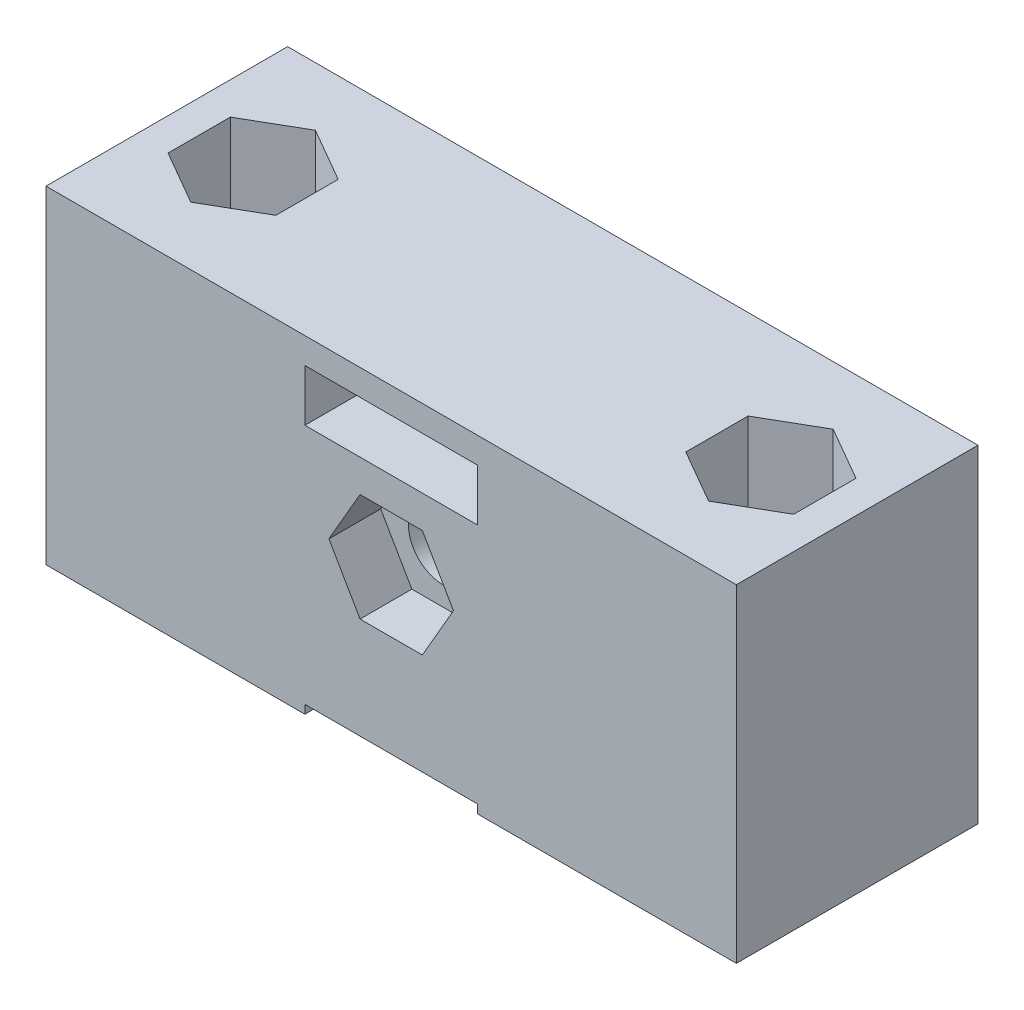
ISO-10303-21;
HEADER;
FILE_DESCRIPTION(('STEP AP214'),'2;1');
FILE_NAME('part.step','',(''),(''),'','','');
FILE_SCHEMA(('AUTOMOTIVE_DESIGN { 1 0 10303 214 1 1 1 1 }'));
ENDSEC;
DATA;
#1=APPLICATION_CONTEXT('core data for automotive mechanical design processes');
#2=APPLICATION_PROTOCOL_DEFINITION('international standard','automotive_design',2000,#1);
#3=PRODUCT_CONTEXT('',#1,'mechanical');
#4=PRODUCT('Part','Part','',(#3));
#5=PRODUCT_RELATED_PRODUCT_CATEGORY('part','',(#4));
#6=PRODUCT_DEFINITION_FORMATION('','',#4);
#7=PRODUCT_DEFINITION_CONTEXT('part definition',#1,'design');
#8=PRODUCT_DEFINITION('design','',#6,#7);
#9=PRODUCT_DEFINITION_SHAPE('','',#8);
#10=(LENGTH_UNIT() NAMED_UNIT(*) SI_UNIT(.MILLI.,.METRE.));
#11=(NAMED_UNIT(*) PLANE_ANGLE_UNIT() SI_UNIT($,.RADIAN.));
#12=(NAMED_UNIT(*) SI_UNIT($,.STERADIAN.) SOLID_ANGLE_UNIT());
#13=UNCERTAINTY_MEASURE_WITH_UNIT(LENGTH_MEASURE(1.E-05),#10,'distance_accuracy_value','');
#14=(GEOMETRIC_REPRESENTATION_CONTEXT(3) GLOBAL_UNCERTAINTY_ASSIGNED_CONTEXT((#13)) GLOBAL_UNIT_ASSIGNED_CONTEXT((#10,
#11,#12)) REPRESENTATION_CONTEXT('',''));
#15=CARTESIAN_POINT('',(0.,0.,0.));
#16=DIRECTION('',(0.,0.,1.));
#17=DIRECTION('',(1.,0.,0.));
#18=AXIS2_PLACEMENT_3D('',#15,#16,#17);
#19=CARTESIAN_POINT('',(0.,9.5,-7.));
#20=DIRECTION('',(0.,0.,1.));
#21=DIRECTION('',(1.,0.,0.));
#22=AXIS2_PLACEMENT_3D('',#19,#20,#21);
#23=CYLINDRICAL_SURFACE('',#22,2.);
#24=CARTESIAN_POINT('',(0.,9.5,-7.));
#25=DIRECTION('',(0.,0.,1.));
#26=DIRECTION('',(1.,0.,0.));
#27=AXIS2_PLACEMENT_3D('',#24,#25,#26);
#28=CIRCLE('',#27,2.);
#29=CARTESIAN_POINT('',(2.,9.5,-7.));
#30=VERTEX_POINT('',#29);
#31=EDGE_CURVE('E389',#30,#30,#28,.T.);
#32=ORIENTED_EDGE('',*,*,#31,.F.);
#33=EDGE_LOOP('',(#32));
#34=FACE_BOUND('',#33,.T.);
#35=CARTESIAN_POINT('',(0.,9.5,4.));
#36=DIRECTION('',(0.,0.,1.));
#37=DIRECTION('',(1.,0.,0.));
#38=AXIS2_PLACEMENT_3D('',#35,#36,#37);
#39=CIRCLE('',#38,2.);
#40=CARTESIAN_POINT('',(2.,9.5,4.));
#41=VERTEX_POINT('',#40);
#42=EDGE_CURVE('E37',#41,#41,#39,.F.);
#43=ORIENTED_EDGE('',*,*,#42,.F.);
#44=EDGE_LOOP('',(#43));
#45=FACE_BOUND('',#44,.T.);
#46=ADVANCED_FACE('F33',(#34,#45),#23,.F.);
#47=CARTESIAN_POINT('',(-15.,0.,0.));
#48=DIRECTION('',(0.,1.,0.));
#49=DIRECTION('',(0.,0.,1.));
#50=AXIS2_PLACEMENT_3D('',#47,#48,#49);
#51=CYLINDRICAL_SURFACE('',#50,1.6);
#52=CARTESIAN_POINT('',(-15.,0.,0.));
#53=DIRECTION('',(0.,1.,0.));
#54=DIRECTION('',(0.,0.,1.));
#55=AXIS2_PLACEMENT_3D('',#52,#53,#54);
#56=CIRCLE('',#55,1.6);
#57=CARTESIAN_POINT('',(-15.,0.,1.6));
#58=VERTEX_POINT('',#57);
#59=EDGE_CURVE('E386',#58,#58,#56,.T.);
#60=ORIENTED_EDGE('',*,*,#59,.F.);
#61=EDGE_LOOP('',(#60));
#62=FACE_BOUND('',#61,.T.);
#63=CARTESIAN_POINT('',(-15.,9.,0.));
#64=DIRECTION('',(0.,1.,0.));
#65=DIRECTION('',(0.,0.,1.));
#66=AXIS2_PLACEMENT_3D('',#63,#64,#65);
#67=CIRCLE('',#66,1.6);
#68=CARTESIAN_POINT('',(-15.,9.,1.6));
#69=VERTEX_POINT('',#68);
#70=EDGE_CURVE('E372',#69,#69,#67,.F.);
#71=ORIENTED_EDGE('',*,*,#70,.F.);
#72=EDGE_LOOP('',(#71));
#73=FACE_BOUND('',#72,.T.);
#74=ADVANCED_FACE('F506',(#62,#73),#51,.F.);
#75=CARTESIAN_POINT('',(0.,0.,0.));
#76=DIRECTION('',(0.,1.,0.));
#77=DIRECTION('',(0.,0.,1.));
#78=AXIS2_PLACEMENT_3D('',#75,#76,#77);
#79=PLANE('',#78);
#80=CARTESIAN_POINT('',(15.,0.,0.));
#81=DIRECTION('',(0.,1.,0.));
#82=DIRECTION('',(0.,0.,-1.));
#83=AXIS2_PLACEMENT_3D('',#80,#81,#82);
#84=CIRCLE('',#83,1.6);
#85=CARTESIAN_POINT('',(15.,0.,-1.60000000000002));
#86=VERTEX_POINT('',#85);
#87=EDGE_CURVE('E383',#86,#86,#84,.T.);
#88=ORIENTED_EDGE('',*,*,#87,.T.);
#89=EDGE_LOOP('',(#88));
#90=FACE_BOUND('',#89,.T.);
#91=DIRECTION('',(1.,0.,0.));
#92=VECTOR('',#91,1.);
#93=CARTESIAN_POINT('',(-20.,0.,7.));
#94=LINE('',#93,#92);
#95=CARTESIAN_POINT('',(5.,0.,7.));
#96=VERTEX_POINT('',#95);
#97=CARTESIAN_POINT('',(20.,0.,7.));
#98=VERTEX_POINT('',#97);
#99=EDGE_CURVE('E465',#96,#98,#94,.T.);
#100=ORIENTED_EDGE('',*,*,#99,.F.);
#101=DIRECTION('',(0.,0.,-1.));
#102=VECTOR('',#101,1.);
#103=CARTESIAN_POINT('',(5.,0.,0.));
#104=LINE('',#103,#102);
#105=CARTESIAN_POINT('',(5.,0.,-7.));
#106=VERTEX_POINT('',#105);
#107=EDGE_CURVE('E11',#96,#106,#104,.T.);
#108=ORIENTED_EDGE('',*,*,#107,.T.);
#109=DIRECTION('',(-1.,0.,0.));
#110=VECTOR('',#109,1.);
#111=CARTESIAN_POINT('',(-20.,0.,-7.));
#112=LINE('',#111,#110);
#113=CARTESIAN_POINT('',(20.,0.,-7.));
#114=VERTEX_POINT('',#113);
#115=EDGE_CURVE('E460',#114,#106,#112,.T.);
#116=ORIENTED_EDGE('',*,*,#115,.F.);
#117=DIRECTION('',(0.,0.,-1.));
#118=VECTOR('',#117,1.);
#119=CARTESIAN_POINT('',(20.,0.,-7.));
#120=LINE('',#119,#118);
#121=EDGE_CURVE('E445',#98,#114,#120,.T.);
#122=ORIENTED_EDGE('',*,*,#121,.F.);
#123=EDGE_LOOP('',(#100,#108,#116,#122));
#124=FACE_BOUND('',#123,.T.);
#125=ADVANCED_FACE('F512',(#90,#124),#79,.F.);
#126=CARTESIAN_POINT('',(20.,19.,-7.));
#127=DIRECTION('',(-1.,0.,0.));
#128=DIRECTION('',(0.,0.,1.));
#129=AXIS2_PLACEMENT_3D('',#126,#127,#128);
#130=PLANE('',#129);
#131=ORIENTED_EDGE('',*,*,#121,.T.);
#132=DIRECTION('',(0.,-1.,0.));
#133=VECTOR('',#132,1.);
#134=CARTESIAN_POINT('',(20.,19.,-7.));
#135=LINE('',#134,#133);
#136=CARTESIAN_POINT('',(20.,19.,-7.));
#137=VERTEX_POINT('',#136);
#138=EDGE_CURVE('E476',#137,#114,#135,.T.);
#139=ORIENTED_EDGE('',*,*,#138,.F.);
#140=DIRECTION('',(0.,0.,-1.));
#141=VECTOR('',#140,1.);
#142=CARTESIAN_POINT('',(20.,19.,-7.));
#143=LINE('',#142,#141);
#144=CARTESIAN_POINT('',(20.,19.,7.));
#145=VERTEX_POINT('',#144);
#146=EDGE_CURVE('E446',#145,#137,#143,.T.);
#147=ORIENTED_EDGE('',*,*,#146,.F.);
#148=DIRECTION('',(0.,-1.,0.));
#149=VECTOR('',#148,1.);
#150=CARTESIAN_POINT('',(20.,19.,7.));
#151=LINE('',#150,#149);
#152=EDGE_CURVE('E456',#145,#98,#151,.T.);
#153=ORIENTED_EDGE('',*,*,#152,.T.);
#154=EDGE_LOOP('',(#131,#139,#147,#153));
#155=FACE_BOUND('',#154,.T.);
#156=ADVANCED_FACE('F35',(#155),#130,.F.);
#157=CARTESIAN_POINT('',(-20.,19.,-7.));
#158=DIRECTION('',(0.,0.,1.));
#159=DIRECTION('',(1.,0.,0.));
#160=AXIS2_PLACEMENT_3D('',#157,#158,#159);
#161=PLANE('',#160);
#162=ORIENTED_EDGE('',*,*,#31,.T.);
#163=EDGE_LOOP('',(#162));
#164=FACE_BOUND('',#163,.T.);
#165=ORIENTED_EDGE('',*,*,#115,.T.);
#166=DIRECTION('',(0.,1.,0.));
#167=VECTOR('',#166,1.);
#168=CARTESIAN_POINT('',(5.,19.,-7.));
#169=LINE('',#168,#167);
#170=CARTESIAN_POINT('',(5.,0.5,-7.));
#171=VERTEX_POINT('',#170);
#172=EDGE_CURVE('E407',#106,#171,#169,.T.);
#173=ORIENTED_EDGE('',*,*,#172,.T.);
#174=DIRECTION('',(-1.,0.,0.));
#175=VECTOR('',#174,1.);
#176=CARTESIAN_POINT('',(-20.,0.5,-7.));
#177=LINE('',#176,#175);
#178=CARTESIAN_POINT('',(-5.,0.5,-7.));
#179=VERTEX_POINT('',#178);
#180=EDGE_CURVE('E410',#171,#179,#177,.T.);
#181=ORIENTED_EDGE('',*,*,#180,.T.);
#182=DIRECTION('',(0.,-1.,0.));
#183=VECTOR('',#182,1.);
#184=CARTESIAN_POINT('',(-5.,19.,-7.));
#185=LINE('',#184,#183);
#186=CARTESIAN_POINT('',(-5.,0.,-7.));
#187=VERTEX_POINT('',#186);
#188=EDGE_CURVE('E403',#179,#187,#185,.T.);
#189=ORIENTED_EDGE('',*,*,#188,.T.);
#190=CARTESIAN_POINT('',(-20.,0.,-7.));
#191=VERTEX_POINT('',#190);
#192=EDGE_CURVE('E459',#187,#191,#112,.T.);
#193=ORIENTED_EDGE('',*,*,#192,.T.);
#194=DIRECTION('',(0.,-1.,0.));
#195=VECTOR('',#194,1.);
#196=CARTESIAN_POINT('',(-20.,19.,-7.));
#197=LINE('',#196,#195);
#198=CARTESIAN_POINT('',(-20.,19.,-7.));
#199=VERTEX_POINT('',#198);
#200=EDGE_CURVE('E473',#199,#191,#197,.T.);
#201=ORIENTED_EDGE('',*,*,#200,.F.);
#202=DIRECTION('',(-1.,0.,0.));
#203=VECTOR('',#202,1.);
#204=CARTESIAN_POINT('',(-20.,19.,-7.));
#205=LINE('',#204,#203);
#206=EDGE_CURVE('E449',#137,#199,#205,.T.);
#207=ORIENTED_EDGE('',*,*,#206,.F.);
#208=ORIENTED_EDGE('',*,*,#138,.T.);
#209=EDGE_LOOP('',(#165,#173,#181,#189,#193,#201,#207,#208));
#210=FACE_BOUND('',#209,.T.);
#211=DIRECTION('',(1.,0.,0.));
#212=VECTOR('',#211,1.);
#213=CARTESIAN_POINT('',(-20.,14.5,-7.));
#214=LINE('',#213,#212);
#215=CARTESIAN_POINT('',(-5.,14.5,-7.));
#216=VERTEX_POINT('',#215);
#217=CARTESIAN_POINT('',(5.,14.5,-7.));
#218=VERTEX_POINT('',#217);
#219=EDGE_CURVE('E439',#216,#218,#214,.T.);
#220=ORIENTED_EDGE('',*,*,#219,.T.);
#221=DIRECTION('',(0.,1.,0.));
#222=VECTOR('',#221,1.);
#223=CARTESIAN_POINT('',(5.,19.,-7.));
#224=LINE('',#223,#222);
#225=CARTESIAN_POINT('',(5.,17.5,-7.));
#226=VERTEX_POINT('',#225);
#227=EDGE_CURVE('E442',#218,#226,#224,.T.);
#228=ORIENTED_EDGE('',*,*,#227,.T.);
#229=DIRECTION('',(-1.,0.,0.));
#230=VECTOR('',#229,1.);
#231=CARTESIAN_POINT('',(-20.,17.5,-7.));
#232=LINE('',#231,#230);
#233=CARTESIAN_POINT('',(-5.,17.5,-7.));
#234=VERTEX_POINT('',#233);
#235=EDGE_CURVE('E427',#226,#234,#232,.T.);
#236=ORIENTED_EDGE('',*,*,#235,.T.);
#237=DIRECTION('',(0.,-1.,0.));
#238=VECTOR('',#237,1.);
#239=CARTESIAN_POINT('',(-5.,19.,-7.));
#240=LINE('',#239,#238);
#241=EDGE_CURVE('E436',#234,#216,#240,.T.);
#242=ORIENTED_EDGE('',*,*,#241,.T.);
#243=EDGE_LOOP('',(#220,#228,#236,#242));
#244=FACE_BOUND('',#243,.T.);
#245=ADVANCED_FACE('F561',(#164,#210,#244),#161,.F.);
#246=CARTESIAN_POINT('',(-20.,19.,-7.));
#247=DIRECTION('',(1.,0.,0.));
#248=DIRECTION('',(0.,0.,-1.));
#249=AXIS2_PLACEMENT_3D('',#246,#247,#248);
#250=PLANE('',#249);
#251=DIRECTION('',(0.,0.,1.));
#252=VECTOR('',#251,1.);
#253=CARTESIAN_POINT('',(-20.,0.,-7.));
#254=LINE('',#253,#252);
#255=CARTESIAN_POINT('',(-20.,0.,7.));
#256=VERTEX_POINT('',#255);
#257=EDGE_CURVE('E463',#191,#256,#254,.T.);
#258=ORIENTED_EDGE('',*,*,#257,.T.);
#259=DIRECTION('',(0.,-1.,0.));
#260=VECTOR('',#259,1.);
#261=CARTESIAN_POINT('',(-20.,19.,7.));
#262=LINE('',#261,#260);
#263=CARTESIAN_POINT('',(-20.,19.,7.));
#264=VERTEX_POINT('',#263);
#265=EDGE_CURVE('E470',#264,#256,#262,.T.);
#266=ORIENTED_EDGE('',*,*,#265,.F.);
#267=DIRECTION('',(0.,0.,1.));
#268=VECTOR('',#267,1.);
#269=CARTESIAN_POINT('',(-20.,19.,-7.));
#270=LINE('',#269,#268);
#271=EDGE_CURVE('E452',#199,#264,#270,.T.);
#272=ORIENTED_EDGE('',*,*,#271,.F.);
#273=ORIENTED_EDGE('',*,*,#200,.T.);
#274=EDGE_LOOP('',(#258,#266,#272,#273));
#275=FACE_BOUND('',#274,.T.);
#276=ADVANCED_FACE('F558',(#275),#250,.F.);
#277=CARTESIAN_POINT('',(-20.,19.,7.));
#278=DIRECTION('',(0.,0.,-1.));
#279=DIRECTION('',(-1.,0.,0.));
#280=AXIS2_PLACEMENT_3D('',#277,#278,#279);
#281=PLANE('',#280);
#282=DIRECTION('',(-1.,0.,0.));
#283=VECTOR('',#282,1.);
#284=CARTESIAN_POINT('',(1.80421959121758,12.625,7.));
#285=LINE('',#284,#283);
#286=CARTESIAN_POINT('',(1.80421959121758,12.625,7.));
#287=VERTEX_POINT('',#286);
#288=CARTESIAN_POINT('',(-1.80421959121758,12.625,7.));
#289=VERTEX_POINT('',#288);
#290=EDGE_CURVE('E268',#287,#289,#285,.T.);
#291=ORIENTED_EDGE('',*,*,#290,.F.);
#292=DIRECTION('',(-0.5,0.866025403784439,0.));
#293=VECTOR('',#292,1.);
#294=CARTESIAN_POINT('',(3.60843918243516,9.5,7.));
#295=LINE('',#294,#293);
#296=CARTESIAN_POINT('',(3.60843918243516,9.5,7.));
#297=VERTEX_POINT('',#296);
#298=EDGE_CURVE('E50',#297,#287,#295,.T.);
#299=ORIENTED_EDGE('',*,*,#298,.F.);
#300=DIRECTION('',(0.5,0.866025403784439,0.));
#301=VECTOR('',#300,1.);
#302=CARTESIAN_POINT('',(1.80421959121758,6.375,7.));
#303=LINE('',#302,#301);
#304=CARTESIAN_POINT('',(1.80421959121758,6.375,7.));
#305=VERTEX_POINT('',#304);
#306=EDGE_CURVE('E254',#305,#297,#303,.T.);
#307=ORIENTED_EDGE('',*,*,#306,.F.);
#308=DIRECTION('',(1.,0.,0.));
#309=VECTOR('',#308,1.);
#310=CARTESIAN_POINT('',(-1.80421959121758,6.375,7.));
#311=LINE('',#310,#309);
#312=CARTESIAN_POINT('',(-1.80421959121758,6.375,7.));
#313=VERTEX_POINT('',#312);
#314=EDGE_CURVE('E257',#313,#305,#311,.T.);
#315=ORIENTED_EDGE('',*,*,#314,.F.);
#316=DIRECTION('',(0.5,-0.866025403784438,0.));
#317=VECTOR('',#316,1.);
#318=CARTESIAN_POINT('',(-3.60843918243516,9.5,7.));
#319=LINE('',#318,#317);
#320=CARTESIAN_POINT('',(-3.60843918243516,9.5,7.));
#321=VERTEX_POINT('',#320);
#322=EDGE_CURVE('E273',#321,#313,#319,.T.);
#323=ORIENTED_EDGE('',*,*,#322,.F.);
#324=DIRECTION('',(-0.5,-0.866025403784439,0.));
#325=VECTOR('',#324,1.);
#326=CARTESIAN_POINT('',(-1.80421959121758,12.625,7.));
#327=LINE('',#326,#325);
#328=EDGE_CURVE('E270',#289,#321,#327,.T.);
#329=ORIENTED_EDGE('',*,*,#328,.F.);
#330=EDGE_LOOP('',(#291,#299,#307,#315,#323,#329));
#331=FACE_BOUND('',#330,.T.);
#332=DIRECTION('',(-1.,0.,0.));
#333=VECTOR('',#332,1.);
#334=CARTESIAN_POINT('',(-5.,17.5,7.));
#335=LINE('',#334,#333);
#336=CARTESIAN_POINT('',(5.,17.5,7.));
#337=VERTEX_POINT('',#336);
#338=CARTESIAN_POINT('',(-5.,17.5,7.));
#339=VERTEX_POINT('',#338);
#340=EDGE_CURVE('E415',#337,#339,#335,.T.);
#341=ORIENTED_EDGE('',*,*,#340,.F.);
#342=DIRECTION('',(0.,1.,0.));
#343=VECTOR('',#342,1.);
#344=CARTESIAN_POINT('',(5.,14.5,7.));
#345=LINE('',#344,#343);
#346=CARTESIAN_POINT('',(5.,14.5,7.));
#347=VERTEX_POINT('',#346);
#348=EDGE_CURVE('E413',#347,#337,#345,.T.);
#349=ORIENTED_EDGE('',*,*,#348,.F.);
#350=DIRECTION('',(1.,0.,0.));
#351=VECTOR('',#350,1.);
#352=CARTESIAN_POINT('',(-5.,14.5,7.));
#353=LINE('',#352,#351);
#354=CARTESIAN_POINT('',(-5.,14.5,7.));
#355=VERTEX_POINT('',#354);
#356=EDGE_CURVE('E421',#355,#347,#353,.T.);
#357=ORIENTED_EDGE('',*,*,#356,.F.);
#358=DIRECTION('',(0.,-1.,0.));
#359=VECTOR('',#358,1.);
#360=CARTESIAN_POINT('',(-5.,14.5,7.));
#361=LINE('',#360,#359);
#362=EDGE_CURVE('E418',#339,#355,#361,.T.);
#363=ORIENTED_EDGE('',*,*,#362,.F.);
#364=EDGE_LOOP('',(#341,#349,#357,#363));
#365=FACE_BOUND('',#364,.T.);
#366=DIRECTION('',(-1.,0.,0.));
#367=VECTOR('',#366,1.);
#368=CARTESIAN_POINT('',(-5.,0.5,7.));
#369=LINE('',#368,#367);
#370=CARTESIAN_POINT('',(5.,0.5,7.));
#371=VERTEX_POINT('',#370);
#372=CARTESIAN_POINT('',(-5.,0.5,7.));
#373=VERTEX_POINT('',#372);
#374=EDGE_CURVE('E395',#371,#373,#369,.T.);
#375=ORIENTED_EDGE('',*,*,#374,.F.);
#376=DIRECTION('',(0.,1.,0.));
#377=VECTOR('',#376,1.);
#378=CARTESIAN_POINT('',(5.,-0.5,7.));
#379=LINE('',#378,#377);
#380=EDGE_CURVE('E392',#96,#371,#379,.T.);
#381=ORIENTED_EDGE('',*,*,#380,.F.);
#382=ORIENTED_EDGE('',*,*,#99,.T.);
#383=ORIENTED_EDGE('',*,*,#152,.F.);
#384=DIRECTION('',(1.,0.,0.));
#385=VECTOR('',#384,1.);
#386=CARTESIAN_POINT('',(-20.,19.,7.));
#387=LINE('',#386,#385);
#388=EDGE_CURVE('E454',#264,#145,#387,.T.);
#389=ORIENTED_EDGE('',*,*,#388,.F.);
#390=ORIENTED_EDGE('',*,*,#265,.T.);
#391=CARTESIAN_POINT('',(-5.,0.,7.));
#392=VERTEX_POINT('',#391);
#393=EDGE_CURVE('E450',#256,#392,#94,.T.);
#394=ORIENTED_EDGE('',*,*,#393,.T.);
#395=DIRECTION('',(0.,-1.,0.));
#396=VECTOR('',#395,1.);
#397=CARTESIAN_POINT('',(-5.,-0.5,7.));
#398=LINE('',#397,#396);
#399=EDGE_CURVE('E398',#373,#392,#398,.T.);
#400=ORIENTED_EDGE('',*,*,#399,.F.);
#401=EDGE_LOOP('',(#375,#381,#382,#383,#389,#390,#394,#400));
#402=FACE_BOUND('',#401,.T.);
#403=ADVANCED_FACE('F551',(#331,#365,#402),#281,.F.);
#404=CARTESIAN_POINT('',(0.,19.,0.));
#405=DIRECTION('',(0.,1.,0.));
#406=DIRECTION('',(0.,0.,1.));
#407=AXIS2_PLACEMENT_3D('',#404,#405,#406);
#408=PLANE('',#407);
#409=DIRECTION('',(0.,0.,1.));
#410=VECTOR('',#409,1.);
#411=CARTESIAN_POINT('',(11.875,19.,1.80421959121758));
#412=LINE('',#411,#410);
#413=CARTESIAN_POINT('',(11.875,19.,-1.80421959121758));
#414=VERTEX_POINT('',#413);
#415=CARTESIAN_POINT('',(11.875,19.,1.80421959121758));
#416=VERTEX_POINT('',#415);
#417=EDGE_CURVE('E58',#414,#416,#412,.T.);
#418=ORIENTED_EDGE('',*,*,#417,.F.);
#419=DIRECTION('',(-0.866025403784438,0.,0.5));
#420=VECTOR('',#419,1.);
#421=CARTESIAN_POINT('',(11.875,19.,-1.80421959121758));
#422=LINE('',#421,#420);
#423=CARTESIAN_POINT('',(15.,19.,-3.60843918243516));
#424=VERTEX_POINT('',#423);
#425=EDGE_CURVE('E291',#424,#414,#422,.T.);
#426=ORIENTED_EDGE('',*,*,#425,.F.);
#427=DIRECTION('',(-0.866025403784439,0.,-0.5));
#428=VECTOR('',#427,1.);
#429=CARTESIAN_POINT('',(15.,19.,-3.60843918243516));
#430=LINE('',#429,#428);
#431=CARTESIAN_POINT('',(18.125,19.,-1.80421959121759));
#432=VERTEX_POINT('',#431);
#433=EDGE_CURVE('E317',#432,#424,#430,.T.);
#434=ORIENTED_EDGE('',*,*,#433,.F.);
#435=DIRECTION('',(0.,0.,-1.));
#436=VECTOR('',#435,1.);
#437=CARTESIAN_POINT('',(18.125,19.,-1.80421959121759));
#438=LINE('',#437,#436);
#439=CARTESIAN_POINT('',(18.125,19.,1.80421959121758));
#440=VERTEX_POINT('',#439);
#441=EDGE_CURVE('E314',#440,#432,#438,.T.);
#442=ORIENTED_EDGE('',*,*,#441,.F.);
#443=DIRECTION('',(0.866025403784438,0.,-0.5));
#444=VECTOR('',#443,1.);
#445=CARTESIAN_POINT('',(18.125,19.,1.80421959121758));
#446=LINE('',#445,#444);
#447=CARTESIAN_POINT('',(15.,19.,3.60843918243516));
#448=VERTEX_POINT('',#447);
#449=EDGE_CURVE('E311',#448,#440,#446,.T.);
#450=ORIENTED_EDGE('',*,*,#449,.F.);
#451=DIRECTION('',(0.866025403784439,0.,0.5));
#452=VECTOR('',#451,1.);
#453=CARTESIAN_POINT('',(15.,19.,3.60843918243516));
#454=LINE('',#453,#452);
#455=EDGE_CURVE('E308',#416,#448,#454,.T.);
#456=ORIENTED_EDGE('',*,*,#455,.F.);
#457=EDGE_LOOP('',(#418,#426,#434,#442,#450,#456));
#458=FACE_BOUND('',#457,.T.);
#459=DIRECTION('',(-0.866025403784438,0.,-0.5));
#460=VECTOR('',#459,1.);
#461=CARTESIAN_POINT('',(-11.875,19.,-1.80421959121758));
#462=LINE('',#461,#460);
#463=CARTESIAN_POINT('',(-11.875,19.,-1.80421959121758));
#464=VERTEX_POINT('',#463);
#465=CARTESIAN_POINT('',(-15.,19.,-3.60843918243516));
#466=VERTEX_POINT('',#465);
#467=EDGE_CURVE('E354',#464,#466,#462,.T.);
#468=ORIENTED_EDGE('',*,*,#467,.F.);
#469=DIRECTION('',(0.,0.,-1.));
#470=VECTOR('',#469,1.);
#471=CARTESIAN_POINT('',(-11.875,19.,1.80421959121758));
#472=LINE('',#471,#470);
#473=CARTESIAN_POINT('',(-11.875,19.,1.80421959121758));
#474=VERTEX_POINT('',#473);
#475=EDGE_CURVE('E338',#474,#464,#472,.T.);
#476=ORIENTED_EDGE('',*,*,#475,.F.);
#477=DIRECTION('',(0.866025403784439,0.,-0.5));
#478=VECTOR('',#477,1.);
#479=CARTESIAN_POINT('',(-15.,19.,3.60843918243516));
#480=LINE('',#479,#478);
#481=CARTESIAN_POINT('',(-15.,19.,3.60843918243516));
#482=VERTEX_POINT('',#481);
#483=EDGE_CURVE('E365',#482,#474,#480,.T.);
#484=ORIENTED_EDGE('',*,*,#483,.F.);
#485=DIRECTION('',(0.866025403784439,0.,0.5));
#486=VECTOR('',#485,1.);
#487=CARTESIAN_POINT('',(-18.125,19.,1.80421959121758));
#488=LINE('',#487,#486);
#489=CARTESIAN_POINT('',(-18.125,19.,1.80421959121758));
#490=VERTEX_POINT('',#489);
#491=EDGE_CURVE('E362',#490,#482,#488,.T.);
#492=ORIENTED_EDGE('',*,*,#491,.F.);
#493=DIRECTION('',(0.,0.,1.));
#494=VECTOR('',#493,1.);
#495=CARTESIAN_POINT('',(-18.125,19.,-1.80421959121758));
#496=LINE('',#495,#494);
#497=CARTESIAN_POINT('',(-18.125,19.,-1.80421959121758));
#498=VERTEX_POINT('',#497);
#499=EDGE_CURVE('E359',#498,#490,#496,.T.);
#500=ORIENTED_EDGE('',*,*,#499,.F.);
#501=DIRECTION('',(-0.866025403784439,0.,0.5));
#502=VECTOR('',#501,1.);
#503=CARTESIAN_POINT('',(-15.,19.,-3.60843918243516));
#504=LINE('',#503,#502);
#505=EDGE_CURVE('E356',#466,#498,#504,.T.);
#506=ORIENTED_EDGE('',*,*,#505,.F.);
#507=EDGE_LOOP('',(#468,#476,#484,#492,#500,#506));
#508=FACE_BOUND('',#507,.T.);
#509=ORIENTED_EDGE('',*,*,#146,.T.);
#510=ORIENTED_EDGE('',*,*,#206,.T.);
#511=ORIENTED_EDGE('',*,*,#271,.T.);
#512=ORIENTED_EDGE('',*,*,#388,.T.);
#513=EDGE_LOOP('',(#509,#510,#511,#512));
#514=FACE_BOUND('',#513,.T.);
#515=ADVANCED_FACE('F548',(#458,#508,#514),#408,.T.);
#516=ORIENTED_EDGE('',*,*,#59,.T.);
#517=EDGE_LOOP('',(#516));
#518=FACE_BOUND('',#517,.T.);
#519=ORIENTED_EDGE('',*,*,#192,.F.);
#520=DIRECTION('',(0.,0.,1.));
#521=VECTOR('',#520,1.);
#522=CARTESIAN_POINT('',(-5.,0.,0.));
#523=LINE('',#522,#521);
#524=EDGE_CURVE('E42',#187,#392,#523,.T.);
#525=ORIENTED_EDGE('',*,*,#524,.T.);
#526=ORIENTED_EDGE('',*,*,#393,.F.);
#527=ORIENTED_EDGE('',*,*,#257,.F.);
#528=EDGE_LOOP('',(#519,#525,#526,#527));
#529=FACE_BOUND('',#528,.T.);
#530=ADVANCED_FACE('F546',(#518,#529),#79,.F.);
#531=CARTESIAN_POINT('',(5.,14.5,-23.));
#532=DIRECTION('',(1.,0.,0.));
#533=DIRECTION('',(0.,1.,0.));
#534=AXIS2_PLACEMENT_3D('',#531,#532,#533);
#535=PLANE('',#534);
#536=DIRECTION('',(0.,0.,1.));
#537=VECTOR('',#536,1.);
#538=CARTESIAN_POINT('',(5.,14.5,-23.));
#539=LINE('',#538,#537);
#540=EDGE_CURVE('E425',#218,#347,#539,.T.);
#541=ORIENTED_EDGE('',*,*,#540,.T.);
#542=ORIENTED_EDGE('',*,*,#348,.T.);
#543=DIRECTION('',(0.,0.,1.));
#544=VECTOR('',#543,1.);
#545=CARTESIAN_POINT('',(5.,17.5,-23.));
#546=LINE('',#545,#544);
#547=EDGE_CURVE('E424',#226,#337,#546,.T.);
#548=ORIENTED_EDGE('',*,*,#547,.F.);
#549=ORIENTED_EDGE('',*,*,#227,.F.);
#550=EDGE_LOOP('',(#541,#542,#548,#549));
#551=FACE_BOUND('',#550,.T.);
#552=ADVANCED_FACE('F536',(#551),#535,.F.);
#553=CARTESIAN_POINT('',(-5.,14.5,-23.));
#554=DIRECTION('',(0.,-1.,0.));
#555=DIRECTION('',(0.,0.,-1.));
#556=AXIS2_PLACEMENT_3D('',#553,#554,#555);
#557=PLANE('',#556);
#558=DIRECTION('',(0.,0.,1.));
#559=VECTOR('',#558,1.);
#560=CARTESIAN_POINT('',(-5.,14.5,-23.));
#561=LINE('',#560,#559);
#562=EDGE_CURVE('E428',#216,#355,#561,.T.);
#563=ORIENTED_EDGE('',*,*,#562,.T.);
#564=ORIENTED_EDGE('',*,*,#356,.T.);
#565=ORIENTED_EDGE('',*,*,#540,.F.);
#566=ORIENTED_EDGE('',*,*,#219,.F.);
#567=EDGE_LOOP('',(#563,#564,#565,#566));
#568=FACE_BOUND('',#567,.T.);
#569=ADVANCED_FACE('F532',(#568),#557,.F.);
#570=CARTESIAN_POINT('',(-5.,14.5,-23.));
#571=DIRECTION('',(-1.,0.,0.));
#572=DIRECTION('',(0.,0.,1.));
#573=AXIS2_PLACEMENT_3D('',#570,#571,#572);
#574=PLANE('',#573);
#575=DIRECTION('',(0.,0.,1.));
#576=VECTOR('',#575,1.);
#577=CARTESIAN_POINT('',(-5.,17.5,-23.));
#578=LINE('',#577,#576);
#579=EDGE_CURVE('E430',#234,#339,#578,.T.);
#580=ORIENTED_EDGE('',*,*,#579,.T.);
#581=ORIENTED_EDGE('',*,*,#362,.T.);
#582=ORIENTED_EDGE('',*,*,#562,.F.);
#583=ORIENTED_EDGE('',*,*,#241,.F.);
#584=EDGE_LOOP('',(#580,#581,#582,#583));
#585=FACE_BOUND('',#584,.T.);
#586=ADVANCED_FACE('F535',(#585),#574,.F.);
#587=CARTESIAN_POINT('',(-5.,17.5,-23.));
#588=DIRECTION('',(0.,1.,0.));
#589=DIRECTION('',(0.,0.,1.));
#590=AXIS2_PLACEMENT_3D('',#587,#588,#589);
#591=PLANE('',#590);
#592=ORIENTED_EDGE('',*,*,#547,.T.);
#593=ORIENTED_EDGE('',*,*,#340,.T.);
#594=ORIENTED_EDGE('',*,*,#579,.F.);
#595=ORIENTED_EDGE('',*,*,#235,.F.);
#596=EDGE_LOOP('',(#592,#593,#594,#595));
#597=FACE_BOUND('',#596,.T.);
#598=ADVANCED_FACE('F527',(#597),#591,.F.);
#599=CARTESIAN_POINT('',(-5.,0.5,-23.));
#600=DIRECTION('',(0.,1.,0.));
#601=DIRECTION('',(0.,0.,1.));
#602=AXIS2_PLACEMENT_3D('',#599,#600,#601);
#603=PLANE('',#602);
#604=DIRECTION('',(0.,0.,1.));
#605=VECTOR('',#604,1.);
#606=CARTESIAN_POINT('',(5.,0.5,-23.));
#607=LINE('',#606,#605);
#608=EDGE_CURVE('E400',#171,#371,#607,.T.);
#609=ORIENTED_EDGE('',*,*,#608,.T.);
#610=ORIENTED_EDGE('',*,*,#374,.T.);
#611=DIRECTION('',(0.,0.,1.));
#612=VECTOR('',#611,1.);
#613=CARTESIAN_POINT('',(-5.,0.5,-23.));
#614=LINE('',#613,#612);
#615=EDGE_CURVE('E401',#179,#373,#614,.T.);
#616=ORIENTED_EDGE('',*,*,#615,.F.);
#617=ORIENTED_EDGE('',*,*,#180,.F.);
#618=EDGE_LOOP('',(#609,#610,#616,#617));
#619=FACE_BOUND('',#618,.T.);
#620=ADVANCED_FACE('F524',(#619),#603,.F.);
#621=CARTESIAN_POINT('',(5.,-0.5,-23.));
#622=DIRECTION('',(1.,0.,0.));
#623=DIRECTION('',(0.,0.,-1.));
#624=AXIS2_PLACEMENT_3D('',#621,#622,#623);
#625=PLANE('',#624);
#626=ORIENTED_EDGE('',*,*,#107,.F.);
#627=ORIENTED_EDGE('',*,*,#380,.T.);
#628=ORIENTED_EDGE('',*,*,#608,.F.);
#629=ORIENTED_EDGE('',*,*,#172,.F.);
#630=EDGE_LOOP('',(#626,#627,#628,#629));
#631=FACE_BOUND('',#630,.T.);
#632=ADVANCED_FACE('F522',(#631),#625,.F.);
#633=CARTESIAN_POINT('',(-5.,-0.5,-23.));
#634=DIRECTION('',(-1.,0.,0.));
#635=DIRECTION('',(0.,0.,1.));
#636=AXIS2_PLACEMENT_3D('',#633,#634,#635);
#637=PLANE('',#636);
#638=ORIENTED_EDGE('',*,*,#615,.T.);
#639=ORIENTED_EDGE('',*,*,#399,.T.);
#640=ORIENTED_EDGE('',*,*,#524,.F.);
#641=ORIENTED_EDGE('',*,*,#188,.F.);
#642=EDGE_LOOP('',(#638,#639,#640,#641));
#643=FACE_BOUND('',#642,.T.);
#644=ADVANCED_FACE('F519',(#643),#637,.F.);
#645=CARTESIAN_POINT('',(15.,0.,0.));
#646=DIRECTION('',(0.,1.,0.));
#647=DIRECTION('',(0.,0.,1.));
#648=AXIS2_PLACEMENT_3D('',#645,#646,#647);
#649=CYLINDRICAL_SURFACE('',#648,1.6);
#650=CARTESIAN_POINT('',(15.,9.,0.));
#651=DIRECTION('',(0.,-1.,0.));
#652=DIRECTION('',(0.,0.,-1.));
#653=AXIS2_PLACEMENT_3D('',#650,#651,#652);
#654=CIRCLE('',#653,1.6);
#655=CARTESIAN_POINT('',(15.,9.,-1.60000000000002));
#656=VERTEX_POINT('',#655);
#657=EDGE_CURVE('E324',#656,#656,#654,.F.);
#658=ORIENTED_EDGE('',*,*,#657,.T.);
#659=EDGE_LOOP('',(#658));
#660=FACE_BOUND('',#659,.T.);
#661=ORIENTED_EDGE('',*,*,#87,.F.);
#662=EDGE_LOOP('',(#661));
#663=FACE_BOUND('',#662,.T.);
#664=ADVANCED_FACE('F485',(#660,#663),#649,.F.);
#665=CARTESIAN_POINT('',(0.,9.,0.));
#666=DIRECTION('',(0.,1.,0.));
#667=DIRECTION('',(0.,0.,1.));
#668=AXIS2_PLACEMENT_3D('',#665,#666,#667);
#669=PLANE('',#668);
#670=DIRECTION('',(-0.866025403784438,0.,-0.5));
#671=VECTOR('',#670,1.);
#672=CARTESIAN_POINT('',(-11.875,9.,-1.80421959121758));
#673=LINE('',#672,#671);
#674=CARTESIAN_POINT('',(-11.875,9.,-1.80421959121758));
#675=VERTEX_POINT('',#674);
#676=CARTESIAN_POINT('',(-15.,9.,-3.60843918243516));
#677=VERTEX_POINT('',#676);
#678=EDGE_CURVE('E334',#675,#677,#673,.T.);
#679=ORIENTED_EDGE('',*,*,#678,.T.);
#680=DIRECTION('',(-0.866025403784439,0.,0.5));
#681=VECTOR('',#680,1.);
#682=CARTESIAN_POINT('',(-15.,9.,-3.60843918243516));
#683=LINE('',#682,#681);
#684=CARTESIAN_POINT('',(-18.125,9.,-1.80421959121758));
#685=VERTEX_POINT('',#684);
#686=EDGE_CURVE('E337',#677,#685,#683,.T.);
#687=ORIENTED_EDGE('',*,*,#686,.T.);
#688=DIRECTION('',(0.,0.,1.));
#689=VECTOR('',#688,1.);
#690=CARTESIAN_POINT('',(-18.125,9.,-1.80421959121758));
#691=LINE('',#690,#689);
#692=CARTESIAN_POINT('',(-18.125,9.,1.80421959121758));
#693=VERTEX_POINT('',#692);
#694=EDGE_CURVE('E341',#685,#693,#691,.T.);
#695=ORIENTED_EDGE('',*,*,#694,.T.);
#696=DIRECTION('',(0.866025403784439,0.,0.5));
#697=VECTOR('',#696,1.);
#698=CARTESIAN_POINT('',(-18.125,9.,1.80421959121758));
#699=LINE('',#698,#697);
#700=CARTESIAN_POINT('',(-15.,9.,3.60843918243516));
#701=VERTEX_POINT('',#700);
#702=EDGE_CURVE('E344',#693,#701,#699,.T.);
#703=ORIENTED_EDGE('',*,*,#702,.T.);
#704=DIRECTION('',(0.866025403784439,0.,-0.5));
#705=VECTOR('',#704,1.);
#706=CARTESIAN_POINT('',(-15.,9.,3.60843918243516));
#707=LINE('',#706,#705);
#708=CARTESIAN_POINT('',(-11.875,9.,1.80421959121758));
#709=VERTEX_POINT('',#708);
#710=EDGE_CURVE('E347',#701,#709,#707,.T.);
#711=ORIENTED_EDGE('',*,*,#710,.T.);
#712=DIRECTION('',(0.,0.,-1.));
#713=VECTOR('',#712,1.);
#714=CARTESIAN_POINT('',(-11.875,9.,1.80421959121758));
#715=LINE('',#714,#713);
#716=EDGE_CURVE('E350',#709,#675,#715,.T.);
#717=ORIENTED_EDGE('',*,*,#716,.T.);
#718=EDGE_LOOP('',(#679,#687,#695,#703,#711,#717));
#719=FACE_BOUND('',#718,.T.);
#720=ORIENTED_EDGE('',*,*,#70,.T.);
#721=EDGE_LOOP('',(#720));
#722=FACE_BOUND('',#721,.T.);
#723=ADVANCED_FACE('F607',(#719,#722),#669,.T.);
#724=CARTESIAN_POINT('',(-11.875,9.,-1.80421959121758));
#725=DIRECTION('',(0.5,0.,-0.866025403784439));
#726=DIRECTION('',(-0.866025403784439,0.,-0.5));
#727=AXIS2_PLACEMENT_3D('',#724,#725,#726);
#728=PLANE('',#727);
#729=ORIENTED_EDGE('',*,*,#467,.T.);
#730=DIRECTION('',(0.,1.,0.));
#731=VECTOR('',#730,1.);
#732=CARTESIAN_POINT('',(-15.,9.,-3.60843918243516));
#733=LINE('',#732,#731);
#734=EDGE_CURVE('E353',#677,#466,#733,.T.);
#735=ORIENTED_EDGE('',*,*,#734,.F.);
#736=ORIENTED_EDGE('',*,*,#678,.F.);
#737=DIRECTION('',(0.,1.,0.));
#738=VECTOR('',#737,1.);
#739=CARTESIAN_POINT('',(-11.875,9.,-1.80421959121758));
#740=LINE('',#739,#738);
#741=EDGE_CURVE('E370',#675,#464,#740,.T.);
#742=ORIENTED_EDGE('',*,*,#741,.T.);
#743=EDGE_LOOP('',(#729,#735,#736,#742));
#744=FACE_BOUND('',#743,.T.);
#745=ADVANCED_FACE('F611',(#744),#728,.F.);
#746=CARTESIAN_POINT('',(-11.875,9.,1.80421959121758));
#747=DIRECTION('',(1.,0.,0.));
#748=DIRECTION('',(0.,0.,-1.));
#749=AXIS2_PLACEMENT_3D('',#746,#747,#748);
#750=PLANE('',#749);
#751=ORIENTED_EDGE('',*,*,#475,.T.);
#752=ORIENTED_EDGE('',*,*,#741,.F.);
#753=ORIENTED_EDGE('',*,*,#716,.F.);
#754=DIRECTION('',(0.,1.,0.));
#755=VECTOR('',#754,1.);
#756=CARTESIAN_POINT('',(-11.875,9.,1.80421959121758));
#757=LINE('',#756,#755);
#758=EDGE_CURVE('E373',#709,#474,#757,.T.);
#759=ORIENTED_EDGE('',*,*,#758,.T.);
#760=EDGE_LOOP('',(#751,#752,#753,#759));
#761=FACE_BOUND('',#760,.T.);
#762=ADVANCED_FACE('F616',(#761),#750,.F.);
#763=CARTESIAN_POINT('',(-15.,9.,3.60843918243516));
#764=DIRECTION('',(0.5,0.,0.866025403784439));
#765=DIRECTION('',(0.866025403784439,0.,-0.5));
#766=AXIS2_PLACEMENT_3D('',#763,#764,#765);
#767=PLANE('',#766);
#768=ORIENTED_EDGE('',*,*,#483,.T.);
#769=ORIENTED_EDGE('',*,*,#758,.F.);
#770=ORIENTED_EDGE('',*,*,#710,.F.);
#771=DIRECTION('',(0.,1.,0.));
#772=VECTOR('',#771,1.);
#773=CARTESIAN_POINT('',(-15.,9.,3.60843918243516));
#774=LINE('',#773,#772);
#775=EDGE_CURVE('E375',#701,#482,#774,.T.);
#776=ORIENTED_EDGE('',*,*,#775,.T.);
#777=EDGE_LOOP('',(#768,#769,#770,#776));
#778=FACE_BOUND('',#777,.T.);
#779=ADVANCED_FACE('F625',(#778),#767,.F.);
#780=CARTESIAN_POINT('',(-18.125,9.,1.80421959121758));
#781=DIRECTION('',(-0.5,0.,0.866025403784439));
#782=DIRECTION('',(0.866025403784439,0.,0.5));
#783=AXIS2_PLACEMENT_3D('',#780,#781,#782);
#784=PLANE('',#783);
#785=ORIENTED_EDGE('',*,*,#491,.T.);
#786=ORIENTED_EDGE('',*,*,#775,.F.);
#787=ORIENTED_EDGE('',*,*,#702,.F.);
#788=DIRECTION('',(0.,1.,0.));
#789=VECTOR('',#788,1.);
#790=CARTESIAN_POINT('',(-18.125,9.,1.80421959121758));
#791=LINE('',#790,#789);
#792=EDGE_CURVE('E377',#693,#490,#791,.T.);
#793=ORIENTED_EDGE('',*,*,#792,.T.);
#794=EDGE_LOOP('',(#785,#786,#787,#793));
#795=FACE_BOUND('',#794,.T.);
#796=ADVANCED_FACE('F621',(#795),#784,.F.);
#797=CARTESIAN_POINT('',(-18.125,9.,-1.80421959121758));
#798=DIRECTION('',(-1.,0.,0.));
#799=DIRECTION('',(0.,0.,1.));
#800=AXIS2_PLACEMENT_3D('',#797,#798,#799);
#801=PLANE('',#800);
#802=ORIENTED_EDGE('',*,*,#499,.T.);
#803=ORIENTED_EDGE('',*,*,#792,.F.);
#804=ORIENTED_EDGE('',*,*,#694,.F.);
#805=DIRECTION('',(0.,1.,0.));
#806=VECTOR('',#805,1.);
#807=CARTESIAN_POINT('',(-18.125,9.,-1.80421959121758));
#808=LINE('',#807,#806);
#809=EDGE_CURVE('E379',#685,#498,#808,.T.);
#810=ORIENTED_EDGE('',*,*,#809,.T.);
#811=EDGE_LOOP('',(#802,#803,#804,#810));
#812=FACE_BOUND('',#811,.T.);
#813=ADVANCED_FACE('F500',(#812),#801,.F.);
#814=CARTESIAN_POINT('',(-15.,9.,-3.60843918243516));
#815=DIRECTION('',(-0.5,0.,-0.866025403784439));
#816=DIRECTION('',(-0.866025403784439,0.,0.5));
#817=AXIS2_PLACEMENT_3D('',#814,#815,#816);
#818=PLANE('',#817);
#819=ORIENTED_EDGE('',*,*,#505,.T.);
#820=ORIENTED_EDGE('',*,*,#809,.F.);
#821=ORIENTED_EDGE('',*,*,#686,.F.);
#822=ORIENTED_EDGE('',*,*,#734,.T.);
#823=EDGE_LOOP('',(#819,#820,#821,#822));
#824=FACE_BOUND('',#823,.T.);
#825=ADVANCED_FACE('F491',(#824),#818,.F.);
#826=CARTESIAN_POINT('',(0.,9.,0.));
#827=DIRECTION('',(0.,-1.,0.));
#828=DIRECTION('',(0.,0.,-1.));
#829=AXIS2_PLACEMENT_3D('',#826,#827,#828);
#830=PLANE('',#829);
#831=DIRECTION('',(0.,0.,1.));
#832=VECTOR('',#831,1.);
#833=CARTESIAN_POINT('',(11.875,9.,1.80421959121758));
#834=LINE('',#833,#832);
#835=CARTESIAN_POINT('',(11.875,9.,-1.80421959121758));
#836=VERTEX_POINT('',#835);
#837=CARTESIAN_POINT('',(11.875,9.,1.80421959121758));
#838=VERTEX_POINT('',#837);
#839=EDGE_CURVE('E287',#836,#838,#834,.T.);
#840=ORIENTED_EDGE('',*,*,#839,.T.);
#841=DIRECTION('',(0.866025403784439,0.,0.5));
#842=VECTOR('',#841,1.);
#843=CARTESIAN_POINT('',(15.,9.,3.60843918243516));
#844=LINE('',#843,#842);
#845=CARTESIAN_POINT('',(15.,9.,3.60843918243516));
#846=VERTEX_POINT('',#845);
#847=EDGE_CURVE('E290',#838,#846,#844,.T.);
#848=ORIENTED_EDGE('',*,*,#847,.T.);
#849=DIRECTION('',(0.866025403784438,0.,-0.5));
#850=VECTOR('',#849,1.);
#851=CARTESIAN_POINT('',(18.125,9.,1.80421959121758));
#852=LINE('',#851,#850);
#853=CARTESIAN_POINT('',(18.125,9.,1.80421959121758));
#854=VERTEX_POINT('',#853);
#855=EDGE_CURVE('E294',#846,#854,#852,.T.);
#856=ORIENTED_EDGE('',*,*,#855,.T.);
#857=DIRECTION('',(0.,0.,-1.));
#858=VECTOR('',#857,1.);
#859=CARTESIAN_POINT('',(18.125,9.,-1.80421959121759));
#860=LINE('',#859,#858);
#861=CARTESIAN_POINT('',(18.125,9.,-1.80421959121759));
#862=VERTEX_POINT('',#861);
#863=EDGE_CURVE('E297',#854,#862,#860,.T.);
#864=ORIENTED_EDGE('',*,*,#863,.T.);
#865=DIRECTION('',(-0.866025403784439,0.,-0.5));
#866=VECTOR('',#865,1.);
#867=CARTESIAN_POINT('',(15.,9.,-3.60843918243516));
#868=LINE('',#867,#866);
#869=CARTESIAN_POINT('',(15.,9.,-3.60843918243516));
#870=VERTEX_POINT('',#869);
#871=EDGE_CURVE('E300',#862,#870,#868,.T.);
#872=ORIENTED_EDGE('',*,*,#871,.T.);
#873=DIRECTION('',(-0.866025403784438,0.,0.5));
#874=VECTOR('',#873,1.);
#875=CARTESIAN_POINT('',(11.875,9.,-1.80421959121758));
#876=LINE('',#875,#874);
#877=EDGE_CURVE('E303',#870,#836,#876,.T.);
#878=ORIENTED_EDGE('',*,*,#877,.T.);
#879=EDGE_LOOP('',(#840,#848,#856,#864,#872,#878));
#880=FACE_BOUND('',#879,.T.);
#881=ORIENTED_EDGE('',*,*,#657,.F.);
#882=EDGE_LOOP('',(#881));
#883=FACE_BOUND('',#882,.T.);
#884=ADVANCED_FACE('F488',(#880,#883),#830,.F.);
#885=CARTESIAN_POINT('',(11.875,9.,1.80421959121758));
#886=DIRECTION('',(-1.,0.,0.));
#887=DIRECTION('',(0.,0.,1.));
#888=AXIS2_PLACEMENT_3D('',#885,#886,#887);
#889=PLANE('',#888);
#890=ORIENTED_EDGE('',*,*,#417,.T.);
#891=DIRECTION('',(0.,1.,0.));
#892=VECTOR('',#891,1.);
#893=CARTESIAN_POINT('',(11.875,9.,1.80421959121758));
#894=LINE('',#893,#892);
#895=EDGE_CURVE('E306',#838,#416,#894,.T.);
#896=ORIENTED_EDGE('',*,*,#895,.F.);
#897=ORIENTED_EDGE('',*,*,#839,.F.);
#898=DIRECTION('',(0.,1.,0.));
#899=VECTOR('',#898,1.);
#900=CARTESIAN_POINT('',(11.875,9.,-1.80421959121758));
#901=LINE('',#900,#899);
#902=EDGE_CURVE('E322',#836,#414,#901,.T.);
#903=ORIENTED_EDGE('',*,*,#902,.T.);
#904=EDGE_LOOP('',(#890,#896,#897,#903));
#905=FACE_BOUND('',#904,.T.);
#906=ADVANCED_FACE('F490',(#905),#889,.F.);
#907=CARTESIAN_POINT('',(11.875,9.,-1.80421959121758));
#908=DIRECTION('',(-0.5,0.,-0.866025403784438));
#909=DIRECTION('',(-0.866025403784439,0.,0.5));
#910=AXIS2_PLACEMENT_3D('',#907,#908,#909);
#911=PLANE('',#910);
#912=ORIENTED_EDGE('',*,*,#425,.T.);
#913=ORIENTED_EDGE('',*,*,#902,.F.);
#914=ORIENTED_EDGE('',*,*,#877,.F.);
#915=DIRECTION('',(0.,1.,0.));
#916=VECTOR('',#915,1.);
#917=CARTESIAN_POINT('',(15.,9.,-3.60843918243516));
#918=LINE('',#917,#916);
#919=EDGE_CURVE('E325',#870,#424,#918,.T.);
#920=ORIENTED_EDGE('',*,*,#919,.T.);
#921=EDGE_LOOP('',(#912,#913,#914,#920));
#922=FACE_BOUND('',#921,.T.);
#923=ADVANCED_FACE('F498',(#922),#911,.F.);
#924=CARTESIAN_POINT('',(15.,9.,-3.60843918243516));
#925=DIRECTION('',(0.5,0.,-0.866025403784439));
#926=DIRECTION('',(-0.866025403784439,0.,-0.5));
#927=AXIS2_PLACEMENT_3D('',#924,#925,#926);
#928=PLANE('',#927);
#929=ORIENTED_EDGE('',*,*,#433,.T.);
#930=ORIENTED_EDGE('',*,*,#919,.F.);
#931=ORIENTED_EDGE('',*,*,#871,.F.);
#932=DIRECTION('',(0.,1.,0.));
#933=VECTOR('',#932,1.);
#934=CARTESIAN_POINT('',(18.125,9.,-1.80421959121759));
#935=LINE('',#934,#933);
#936=EDGE_CURVE('E327',#862,#432,#935,.T.);
#937=ORIENTED_EDGE('',*,*,#936,.T.);
#938=EDGE_LOOP('',(#929,#930,#931,#937));
#939=FACE_BOUND('',#938,.T.);
#940=ADVANCED_FACE('F644',(#939),#928,.F.);
#941=CARTESIAN_POINT('',(18.125,9.,-1.80421959121759));
#942=DIRECTION('',(1.,0.,0.));
#943=DIRECTION('',(0.,0.,-1.));
#944=AXIS2_PLACEMENT_3D('',#941,#942,#943);
#945=PLANE('',#944);
#946=ORIENTED_EDGE('',*,*,#441,.T.);
#947=ORIENTED_EDGE('',*,*,#936,.F.);
#948=ORIENTED_EDGE('',*,*,#863,.F.);
#949=DIRECTION('',(0.,1.,0.));
#950=VECTOR('',#949,1.);
#951=CARTESIAN_POINT('',(18.125,9.,1.80421959121758));
#952=LINE('',#951,#950);
#953=EDGE_CURVE('E329',#854,#440,#952,.T.);
#954=ORIENTED_EDGE('',*,*,#953,.T.);
#955=EDGE_LOOP('',(#946,#947,#948,#954));
#956=FACE_BOUND('',#955,.T.);
#957=ADVANCED_FACE('F640',(#956),#945,.F.);
#958=CARTESIAN_POINT('',(18.125,9.,1.80421959121758));
#959=DIRECTION('',(0.5,0.,0.866025403784438));
#960=DIRECTION('',(0.866025403784438,0.,-0.5));
#961=AXIS2_PLACEMENT_3D('',#958,#959,#960);
#962=PLANE('',#961);
#963=ORIENTED_EDGE('',*,*,#449,.T.);
#964=ORIENTED_EDGE('',*,*,#953,.F.);
#965=ORIENTED_EDGE('',*,*,#855,.F.);
#966=DIRECTION('',(0.,1.,0.));
#967=VECTOR('',#966,1.);
#968=CARTESIAN_POINT('',(15.,9.,3.60843918243516));
#969=LINE('',#968,#967);
#970=EDGE_CURVE('E331',#846,#448,#969,.T.);
#971=ORIENTED_EDGE('',*,*,#970,.T.);
#972=EDGE_LOOP('',(#963,#964,#965,#971));
#973=FACE_BOUND('',#972,.T.);
#974=ADVANCED_FACE('F636',(#973),#962,.F.);
#975=CARTESIAN_POINT('',(15.,9.,3.60843918243516));
#976=DIRECTION('',(-0.5,0.,0.866025403784439));
#977=DIRECTION('',(0.866025403784439,0.,0.5));
#978=AXIS2_PLACEMENT_3D('',#975,#976,#977);
#979=PLANE('',#978);
#980=ORIENTED_EDGE('',*,*,#455,.T.);
#981=ORIENTED_EDGE('',*,*,#970,.F.);
#982=ORIENTED_EDGE('',*,*,#847,.F.);
#983=ORIENTED_EDGE('',*,*,#895,.T.);
#984=EDGE_LOOP('',(#980,#981,#982,#983));
#985=FACE_BOUND('',#984,.T.);
#986=ADVANCED_FACE('F633',(#985),#979,.F.);
#987=CARTESIAN_POINT('',(0.,0.,4.));
#988=DIRECTION('',(0.,0.,1.));
#989=DIRECTION('',(1.,0.,0.));
#990=AXIS2_PLACEMENT_3D('',#987,#988,#989);
#991=PLANE('',#990);
#992=DIRECTION('',(-0.5,0.866025403784439,0.));
#993=VECTOR('',#992,1.);
#994=CARTESIAN_POINT('',(3.60843918243516,9.5,4.));
#995=LINE('',#994,#993);
#996=CARTESIAN_POINT('',(3.60843918243516,9.5,4.));
#997=VERTEX_POINT('',#996);
#998=CARTESIAN_POINT('',(1.80421959121758,12.625,4.));
#999=VERTEX_POINT('',#998);
#1000=EDGE_CURVE('E234',#997,#999,#995,.T.);
#1001=ORIENTED_EDGE('',*,*,#1000,.T.);
#1002=DIRECTION('',(-1.,0.,0.));
#1003=VECTOR('',#1002,1.);
#1004=CARTESIAN_POINT('',(1.80421959121758,12.625,4.));
#1005=LINE('',#1004,#1003);
#1006=CARTESIAN_POINT('',(-1.80421959121758,12.625,4.));
#1007=VERTEX_POINT('',#1006);
#1008=EDGE_CURVE('E243',#999,#1007,#1005,.T.);
#1009=ORIENTED_EDGE('',*,*,#1008,.T.);
#1010=DIRECTION('',(-0.5,-0.866025403784439,0.));
#1011=VECTOR('',#1010,1.);
#1012=CARTESIAN_POINT('',(-1.80421959121758,12.625,4.));
#1013=LINE('',#1012,#1011);
#1014=CARTESIAN_POINT('',(-3.60843918243516,9.5,4.));
#1015=VERTEX_POINT('',#1014);
#1016=EDGE_CURVE('E248',#1007,#1015,#1013,.T.);
#1017=ORIENTED_EDGE('',*,*,#1016,.T.);
#1018=DIRECTION('',(0.5,-0.866025403784438,0.));
#1019=VECTOR('',#1018,1.);
#1020=CARTESIAN_POINT('',(-3.60843918243516,9.5,4.));
#1021=LINE('',#1020,#1019);
#1022=CARTESIAN_POINT('',(-1.80421959121758,6.375,4.));
#1023=VERTEX_POINT('',#1022);
#1024=EDGE_CURVE('E261',#1015,#1023,#1021,.T.);
#1025=ORIENTED_EDGE('',*,*,#1024,.T.);
#1026=DIRECTION('',(1.,0.,0.));
#1027=VECTOR('',#1026,1.);
#1028=CARTESIAN_POINT('',(-1.80421959121758,6.375,4.));
#1029=LINE('',#1028,#1027);
#1030=CARTESIAN_POINT('',(1.80421959121758,6.375,4.));
#1031=VERTEX_POINT('',#1030);
#1032=EDGE_CURVE('E264',#1023,#1031,#1029,.T.);
#1033=ORIENTED_EDGE('',*,*,#1032,.T.);
#1034=DIRECTION('',(0.5,0.866025403784439,0.));
#1035=VECTOR('',#1034,1.);
#1036=CARTESIAN_POINT('',(1.80421959121758,6.375,4.));
#1037=LINE('',#1036,#1035);
#1038=EDGE_CURVE('E240',#1031,#997,#1037,.T.);
#1039=ORIENTED_EDGE('',*,*,#1038,.T.);
#1040=EDGE_LOOP('',(#1001,#1009,#1017,#1025,#1033,#1039));
#1041=FACE_BOUND('',#1040,.T.);
#1042=ORIENTED_EDGE('',*,*,#42,.T.);
#1043=EDGE_LOOP('',(#1042));
#1044=FACE_BOUND('',#1043,.T.);
#1045=ADVANCED_FACE('F250',(#1041,#1044),#991,.T.);
#1046=CARTESIAN_POINT('',(3.60843918243516,9.5,4.));
#1047=DIRECTION('',(0.866025403784439,0.5,0.));
#1048=DIRECTION('',(-0.5,0.866025403784439,0.));
#1049=AXIS2_PLACEMENT_3D('',#1046,#1047,#1048);
#1050=PLANE('',#1049);
#1051=ORIENTED_EDGE('',*,*,#298,.T.);
#1052=DIRECTION('',(0.,0.,1.));
#1053=VECTOR('',#1052,1.);
#1054=CARTESIAN_POINT('',(1.80421959121758,12.625,4.));
#1055=LINE('',#1054,#1053);
#1056=EDGE_CURVE('E230',#999,#287,#1055,.T.);
#1057=ORIENTED_EDGE('',*,*,#1056,.F.);
#1058=ORIENTED_EDGE('',*,*,#1000,.F.);
#1059=DIRECTION('',(0.,0.,1.));
#1060=VECTOR('',#1059,1.);
#1061=CARTESIAN_POINT('',(3.60843918243516,9.5,4.));
#1062=LINE('',#1061,#1060);
#1063=EDGE_CURVE('E278',#997,#297,#1062,.T.);
#1064=ORIENTED_EDGE('',*,*,#1063,.T.);
#1065=EDGE_LOOP('',(#1051,#1057,#1058,#1064));
#1066=FACE_BOUND('',#1065,.T.);
#1067=ADVANCED_FACE('F232',(#1066),#1050,.F.);
#1068=CARTESIAN_POINT('',(1.80421959121758,6.375,4.));
#1069=DIRECTION('',(0.866025403784438,-0.5,0.));
#1070=DIRECTION('',(0.5,0.866025403784439,0.));
#1071=AXIS2_PLACEMENT_3D('',#1068,#1069,#1070);
#1072=PLANE('',#1071);
#1073=ORIENTED_EDGE('',*,*,#306,.T.);
#1074=ORIENTED_EDGE('',*,*,#1063,.F.);
#1075=ORIENTED_EDGE('',*,*,#1038,.F.);
#1076=DIRECTION('',(0.,0.,1.));
#1077=VECTOR('',#1076,1.);
#1078=CARTESIAN_POINT('',(1.80421959121758,6.375,4.));
#1079=LINE('',#1078,#1077);
#1080=EDGE_CURVE('E280',#1031,#305,#1079,.T.);
#1081=ORIENTED_EDGE('',*,*,#1080,.T.);
#1082=EDGE_LOOP('',(#1073,#1074,#1075,#1081));
#1083=FACE_BOUND('',#1082,.T.);
#1084=ADVANCED_FACE('F710',(#1083),#1072,.F.);
#1085=CARTESIAN_POINT('',(-1.80421959121758,6.375,4.));
#1086=DIRECTION('',(0.,-1.,0.));
#1087=DIRECTION('',(1.,0.,0.));
#1088=AXIS2_PLACEMENT_3D('',#1085,#1086,#1087);
#1089=PLANE('',#1088);
#1090=ORIENTED_EDGE('',*,*,#314,.T.);
#1091=ORIENTED_EDGE('',*,*,#1080,.F.);
#1092=ORIENTED_EDGE('',*,*,#1032,.F.);
#1093=DIRECTION('',(0.,0.,1.));
#1094=VECTOR('',#1093,1.);
#1095=CARTESIAN_POINT('',(-1.80421959121758,6.375,4.));
#1096=LINE('',#1095,#1094);
#1097=EDGE_CURVE('E282',#1023,#313,#1096,.T.);
#1098=ORIENTED_EDGE('',*,*,#1097,.T.);
#1099=EDGE_LOOP('',(#1090,#1091,#1092,#1098));
#1100=FACE_BOUND('',#1099,.T.);
#1101=ADVANCED_FACE('F716',(#1100),#1089,.F.);
#1102=CARTESIAN_POINT('',(-3.60843918243516,9.5,4.));
#1103=DIRECTION('',(-0.866025403784439,-0.5,0.));
#1104=DIRECTION('',(0.5,-0.866025403784439,0.));
#1105=AXIS2_PLACEMENT_3D('',#1102,#1103,#1104);
#1106=PLANE('',#1105);
#1107=ORIENTED_EDGE('',*,*,#322,.T.);
#1108=ORIENTED_EDGE('',*,*,#1097,.F.);
#1109=ORIENTED_EDGE('',*,*,#1024,.F.);
#1110=DIRECTION('',(0.,0.,1.));
#1111=VECTOR('',#1110,1.);
#1112=CARTESIAN_POINT('',(-3.60843918243516,9.5,4.));
#1113=LINE('',#1112,#1111);
#1114=EDGE_CURVE('E284',#1015,#321,#1113,.T.);
#1115=ORIENTED_EDGE('',*,*,#1114,.T.);
#1116=EDGE_LOOP('',(#1107,#1108,#1109,#1115));
#1117=FACE_BOUND('',#1116,.T.);
#1118=ADVANCED_FACE('F724',(#1117),#1106,.F.);
#1119=CARTESIAN_POINT('',(-1.80421959121758,12.625,4.));
#1120=DIRECTION('',(-0.866025403784439,0.5,0.));
#1121=DIRECTION('',(-0.5,-0.866025403784439,0.));
#1122=AXIS2_PLACEMENT_3D('',#1119,#1120,#1121);
#1123=PLANE('',#1122);
#1124=ORIENTED_EDGE('',*,*,#328,.T.);
#1125=ORIENTED_EDGE('',*,*,#1114,.F.);
#1126=ORIENTED_EDGE('',*,*,#1016,.F.);
#1127=DIRECTION('',(0.,0.,1.));
#1128=VECTOR('',#1127,1.);
#1129=CARTESIAN_POINT('',(-1.80421959121758,12.625,4.));
#1130=LINE('',#1129,#1128);
#1131=EDGE_CURVE('E239',#1007,#289,#1130,.T.);
#1132=ORIENTED_EDGE('',*,*,#1131,.T.);
#1133=EDGE_LOOP('',(#1124,#1125,#1126,#1132));
#1134=FACE_BOUND('',#1133,.T.);
#1135=ADVANCED_FACE('F732',(#1134),#1123,.F.);
#1136=CARTESIAN_POINT('',(1.80421959121758,12.625,4.));
#1137=DIRECTION('',(0.,1.,0.));
#1138=DIRECTION('',(-1.,0.,0.));
#1139=AXIS2_PLACEMENT_3D('',#1136,#1137,#1138);
#1140=PLANE('',#1139);
#1141=ORIENTED_EDGE('',*,*,#290,.T.);
#1142=ORIENTED_EDGE('',*,*,#1131,.F.);
#1143=ORIENTED_EDGE('',*,*,#1008,.F.);
#1144=ORIENTED_EDGE('',*,*,#1056,.T.);
#1145=EDGE_LOOP('',(#1141,#1142,#1143,#1144));
#1146=FACE_BOUND('',#1145,.T.);
#1147=ADVANCED_FACE('F244',(#1146),#1140,.F.);
#1148=CLOSED_SHELL('',(#46,#74,#125,#156,#245,#276,#403,#515,#530,#552,#569,#586,#598,#620,#632,
#644,#664,#723,#745,#762,#779,#796,#813,#825,#884,#906,#923,#940,#957,#974,#986,#1045,#1067,
#1084,#1101,#1118,#1135,#1147));
#1149=MANIFOLD_SOLID_BREP('B2',#1148);
#1150=ADVANCED_BREP_SHAPE_REPRESENTATION('',(#18,#1149),#14);
#1151=SHAPE_DEFINITION_REPRESENTATION(#9,#1150);
ENDSEC;
END-ISO-10303-21;
